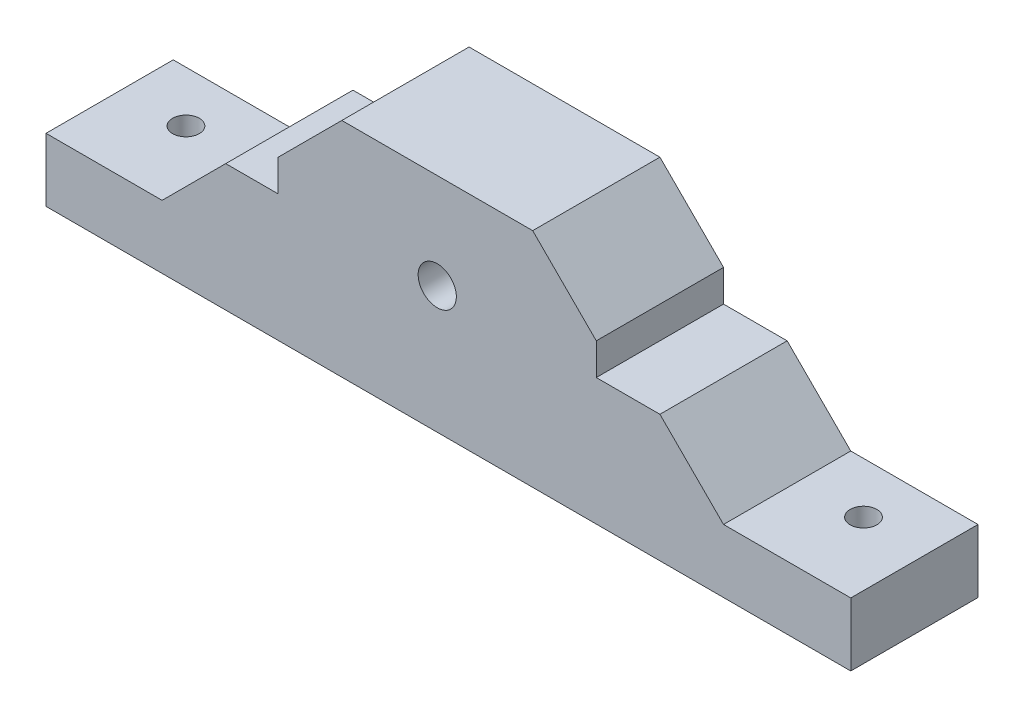
ISO-10303-21;
HEADER;
FILE_DESCRIPTION(('STEP AP214'),'2;1');
FILE_NAME('part.step','',(''),(''),'','','');
FILE_SCHEMA(('AUTOMOTIVE_DESIGN { 1 0 10303 214 1 1 1 1 }'));
ENDSEC;
DATA;
#1=APPLICATION_CONTEXT('core data for automotive mechanical design processes');
#2=APPLICATION_PROTOCOL_DEFINITION('international standard','automotive_design',2000,#1);
#3=PRODUCT_CONTEXT('',#1,'mechanical');
#4=PRODUCT('Part','Part','',(#3));
#5=PRODUCT_RELATED_PRODUCT_CATEGORY('part','',(#4));
#6=PRODUCT_DEFINITION_FORMATION('','',#4);
#7=PRODUCT_DEFINITION_CONTEXT('part definition',#1,'design');
#8=PRODUCT_DEFINITION('design','',#6,#7);
#9=PRODUCT_DEFINITION_SHAPE('','',#8);
#10=(LENGTH_UNIT() NAMED_UNIT(*) SI_UNIT(.MILLI.,.METRE.));
#11=(NAMED_UNIT(*) PLANE_ANGLE_UNIT() SI_UNIT($,.RADIAN.));
#12=(NAMED_UNIT(*) SI_UNIT($,.STERADIAN.) SOLID_ANGLE_UNIT());
#13=UNCERTAINTY_MEASURE_WITH_UNIT(LENGTH_MEASURE(1.E-05),#10,'distance_accuracy_value','');
#14=(GEOMETRIC_REPRESENTATION_CONTEXT(3) GLOBAL_UNCERTAINTY_ASSIGNED_CONTEXT((#13)) GLOBAL_UNIT_ASSIGNED_CONTEXT((#10,
#11,#12)) REPRESENTATION_CONTEXT('',''));
#15=CARTESIAN_POINT('',(0.,0.,0.));
#16=DIRECTION('',(0.,0.,1.));
#17=DIRECTION('',(1.,0.,0.));
#18=AXIS2_PLACEMENT_3D('',#15,#16,#17);
#19=CARTESIAN_POINT('',(-2.3424896013391E-12,254.195974268059,0.));
#20=DIRECTION('',(0.,1.,0.));
#21=DIRECTION('',(-1.,0.,0.));
#22=AXIS2_PLACEMENT_3D('',#19,#20,#21);
#23=PLANE('',#22);
#24=DIRECTION('',(-1.,0.,0.));
#25=VECTOR('',#24,1.);
#26=CARTESIAN_POINT('',(128.058980693892,254.19597426806,32.2731298363772));
#27=LINE('',#26,#25);
#28=CARTESIAN_POINT('',(128.058980693892,254.19597426806,32.2731298363772));
#29=VERTEX_POINT('',#28);
#30=CARTESIAN_POINT('',(1.55898069389335,254.195974268059,32.2731298363772));
#31=VERTEX_POINT('',#30);
#32=EDGE_CURVE('E203',#29,#31,#27,.T.);
#33=ORIENTED_EDGE('',*,*,#32,.F.);
#34=DIRECTION('',(0.,0.,-1.));
#35=VECTOR('',#34,1.);
#36=CARTESIAN_POINT('',(128.058980693892,254.19597426806,52.2731298363772));
#37=LINE('',#36,#35);
#38=CARTESIAN_POINT('',(128.058980693892,254.19597426806,52.2731298363772));
#39=VERTEX_POINT('',#38);
#40=EDGE_CURVE('E195',#39,#29,#37,.T.);
#41=ORIENTED_EDGE('',*,*,#40,.F.);
#42=DIRECTION('',(1.,0.,0.));
#43=VECTOR('',#42,1.);
#44=CARTESIAN_POINT('',(1.55898069389246,254.195974268059,52.2731298363772));
#45=LINE('',#44,#43);
#46=CARTESIAN_POINT('',(1.55898069389246,254.195974268059,52.2731298363772));
#47=VERTEX_POINT('',#46);
#48=EDGE_CURVE('E198',#47,#39,#45,.T.);
#49=ORIENTED_EDGE('',*,*,#48,.F.);
#50=DIRECTION('',(0.,0.,1.));
#51=VECTOR('',#50,1.);
#52=CARTESIAN_POINT('',(1.55898069389335,254.195974268059,32.2731298363772));
#53=LINE('',#52,#51);
#54=EDGE_CURVE('E200',#31,#47,#53,.T.);
#55=ORIENTED_EDGE('',*,*,#54,.F.);
#56=EDGE_LOOP('',(#33,#41,#49,#55));
#57=FACE_BOUND('',#56,.T.);
#58=CARTESIAN_POINT('',(11.5589806899974,254.195974268059,40.2731298363773));
#59=DIRECTION('',(0.,1.,0.));
#60=DIRECTION('',(-1.,0.,0.));
#61=AXIS2_PLACEMENT_3D('',#58,#59,#60);
#62=CIRCLE('',#61,2.1);
#63=CARTESIAN_POINT('',(9.45898068999743,254.195974268059,40.2731298363773));
#64=VERTEX_POINT('',#63);
#65=EDGE_CURVE('E206',#64,#64,#62,.T.);
#66=ORIENTED_EDGE('',*,*,#65,.T.);
#67=EDGE_LOOP('',(#66));
#68=FACE_BOUND('',#67,.T.);
#69=CARTESIAN_POINT('',(118.058980693893,254.19597426806,40.2731298363773));
#70=DIRECTION('',(0.,1.,0.));
#71=DIRECTION('',(-1.,0.,0.));
#72=AXIS2_PLACEMENT_3D('',#69,#70,#71);
#73=CIRCLE('',#72,2.1);
#74=CARTESIAN_POINT('',(115.958980693893,254.19597426806,40.2731298363773));
#75=VERTEX_POINT('',#74);
#76=EDGE_CURVE('E184',#75,#75,#73,.T.);
#77=ORIENTED_EDGE('',*,*,#76,.T.);
#78=EDGE_LOOP('',(#77));
#79=FACE_BOUND('',#78,.T.);
#80=ADVANCED_FACE('F33',(#57,#68,#79),#23,.F.);
#81=CARTESIAN_POINT('',(128.058980693892,294.19597426806,32.2731298363772));
#82=DIRECTION('',(0.,0.,1.));
#83=DIRECTION('',(0.,-1.,0.));
#84=AXIS2_PLACEMENT_3D('',#81,#82,#83);
#85=PLANE('',#84);
#86=CARTESIAN_POINT('',(63.0589806938941,274.145974268058,32.2731298363772));
#87=DIRECTION('',(0.,0.,-1.));
#88=DIRECTION('',(0.,1.,0.));
#89=AXIS2_PLACEMENT_3D('',#86,#87,#88);
#90=CIRCLE('',#89,3.);
#91=CARTESIAN_POINT('',(63.0589806938941,277.145974268058,32.2731298363772));
#92=VERTEX_POINT('',#91);
#93=EDGE_CURVE('E251',#92,#92,#90,.T.);
#94=ORIENTED_EDGE('',*,*,#93,.F.);
#95=EDGE_LOOP('',(#94));
#96=FACE_BOUND('',#95,.T.);
#97=DIRECTION('',(-1.,0.,0.));
#98=VECTOR('',#97,1.);
#99=CARTESIAN_POINT('',(1.55898069389326,264.14597426806,32.2731298363772));
#100=LINE('',#99,#98);
#101=CARTESIAN_POINT('',(19.8089806938926,264.14597426806,32.2731298363772));
#102=VERTEX_POINT('',#101);
#103=CARTESIAN_POINT('',(1.55898069389326,264.14597426806,32.2731298363772));
#104=VERTEX_POINT('',#103);
#105=EDGE_CURVE('E152',#102,#104,#100,.T.);
#106=ORIENTED_EDGE('',*,*,#105,.F.);
#107=DIRECTION('',(-0.707106781186557,-0.707106781186538,0.));
#108=VECTOR('',#107,1.);
#109=CARTESIAN_POINT('',(19.8089806938926,264.145974268058,32.2731298363772));
#110=LINE('',#109,#108);
#111=CARTESIAN_POINT('',(29.8089806938927,274.145974268058,32.2731298363772));
#112=VERTEX_POINT('',#111);
#113=EDGE_CURVE('E156',#102,#112,#110,.F.);
#114=ORIENTED_EDGE('',*,*,#113,.T.);
#115=DIRECTION('',(-1.,0.,0.));
#116=VECTOR('',#115,1.);
#117=CARTESIAN_POINT('',(19.8089806938926,274.145974268058,32.2731298363772));
#118=LINE('',#117,#116);
#119=CARTESIAN_POINT('',(38.0589806938921,274.145974268058,32.2731298363772));
#120=VERTEX_POINT('',#119);
#121=EDGE_CURVE('E224',#120,#112,#118,.T.);
#122=ORIENTED_EDGE('',*,*,#121,.F.);
#123=DIRECTION('',(0.,-1.,0.));
#124=VECTOR('',#123,1.);
#125=CARTESIAN_POINT('',(38.0589806938921,289.14597426806,32.2731298363772));
#126=LINE('',#125,#124);
#127=CARTESIAN_POINT('',(38.0589806938921,279.14597426806,32.2731298363772));
#128=VERTEX_POINT('',#127);
#129=EDGE_CURVE('E226',#128,#120,#126,.T.);
#130=ORIENTED_EDGE('',*,*,#129,.F.);
#131=DIRECTION('',(-0.707106781186549,-0.707106781186546,0.));
#132=VECTOR('',#131,1.);
#133=CARTESIAN_POINT('',(38.0589806938921,279.14597426806,32.2731298363772));
#134=LINE('',#133,#132);
#135=CARTESIAN_POINT('',(48.0589806938922,289.14597426806,32.2731298363772));
#136=VERTEX_POINT('',#135);
#137=EDGE_CURVE('E173',#128,#136,#134,.F.);
#138=ORIENTED_EDGE('',*,*,#137,.T.);
#139=DIRECTION('',(-1.,0.,0.));
#140=VECTOR('',#139,1.);
#141=CARTESIAN_POINT('',(88.0589806938921,289.14597426806,32.2731298363772));
#142=LINE('',#141,#140);
#143=CARTESIAN_POINT('',(78.0589806938921,289.14597426806,32.2731298363772));
#144=VERTEX_POINT('',#143);
#145=EDGE_CURVE('E228',#144,#136,#142,.T.);
#146=ORIENTED_EDGE('',*,*,#145,.F.);
#147=DIRECTION('',(-0.707106781186546,0.707106781186549,0.));
#148=VECTOR('',#147,1.);
#149=CARTESIAN_POINT('',(78.0589806938921,289.14597426806,32.2731298363772));
#150=LINE('',#149,#148);
#151=CARTESIAN_POINT('',(88.0589806938921,279.14597426806,32.2731298363772));
#152=VERTEX_POINT('',#151);
#153=EDGE_CURVE('E175',#144,#152,#150,.F.);
#154=ORIENTED_EDGE('',*,*,#153,.T.);
#155=DIRECTION('',(0.,1.,0.));
#156=VECTOR('',#155,1.);
#157=CARTESIAN_POINT('',(88.0589806938921,274.14597426806,32.2731298363772));
#158=LINE('',#157,#156);
#159=CARTESIAN_POINT('',(88.0589806938921,274.14597426806,32.2731298363772));
#160=VERTEX_POINT('',#159);
#161=EDGE_CURVE('E231',#160,#152,#158,.T.);
#162=ORIENTED_EDGE('',*,*,#161,.F.);
#163=DIRECTION('',(-1.,0.,0.));
#164=VECTOR('',#163,1.);
#165=CARTESIAN_POINT('',(108.058980693892,274.14597426806,32.2731298363772));
#166=LINE('',#165,#164);
#167=CARTESIAN_POINT('',(98.0589806938922,274.14597426806,32.2731298363772));
#168=VERTEX_POINT('',#167);
#169=EDGE_CURVE('E234',#168,#160,#166,.T.);
#170=ORIENTED_EDGE('',*,*,#169,.F.);
#171=DIRECTION('',(-0.707106781186547,0.707106781186548,0.));
#172=VECTOR('',#171,1.);
#173=CARTESIAN_POINT('',(98.0589806938921,274.14597426806,32.2731298363772));
#174=LINE('',#173,#172);
#175=CARTESIAN_POINT('',(108.058980693892,264.14597426806,32.2731298363772));
#176=VERTEX_POINT('',#175);
#177=EDGE_CURVE('E160',#168,#176,#174,.F.);
#178=ORIENTED_EDGE('',*,*,#177,.T.);
#179=DIRECTION('',(-1.,0.,0.));
#180=VECTOR('',#179,1.);
#181=CARTESIAN_POINT('',(108.058980693892,264.14597426806,32.2731298363772));
#182=LINE('',#181,#180);
#183=CARTESIAN_POINT('',(128.058980693892,264.14597426806,32.2731298363772));
#184=VERTEX_POINT('',#183);
#185=EDGE_CURVE('E142',#184,#176,#182,.T.);
#186=ORIENTED_EDGE('',*,*,#185,.F.);
#187=DIRECTION('',(0.,-1.,0.));
#188=VECTOR('',#187,1.);
#189=CARTESIAN_POINT('',(128.058980693892,294.19597426806,32.2731298363772));
#190=LINE('',#189,#188);
#191=EDGE_CURVE('E193',#184,#29,#190,.T.);
#192=ORIENTED_EDGE('',*,*,#191,.T.);
#193=ORIENTED_EDGE('',*,*,#32,.T.);
#194=DIRECTION('',(0.,-1.,0.));
#195=VECTOR('',#194,1.);
#196=CARTESIAN_POINT('',(1.55898069389298,294.195974268059,32.2731298363772));
#197=LINE('',#196,#195);
#198=EDGE_CURVE('E180',#104,#31,#197,.T.);
#199=ORIENTED_EDGE('',*,*,#198,.F.);
#200=EDGE_LOOP('',(#106,#114,#122,#130,#138,#146,#154,#162,#170,#178,#186,#192,#193,#199));
#201=FACE_BOUND('',#200,.T.);
#202=ADVANCED_FACE('F265',(#96,#201),#85,.F.);
#203=CARTESIAN_POINT('',(1.55898069389298,294.195974268059,32.2731298363772));
#204=DIRECTION('',(1.,0.,0.));
#205=DIRECTION('',(0.,0.,-1.));
#206=AXIS2_PLACEMENT_3D('',#203,#204,#205);
#207=PLANE('',#206);
#208=DIRECTION('',(0.,-1.,0.));
#209=VECTOR('',#208,1.);
#210=CARTESIAN_POINT('',(1.55898069389208,294.195974268059,52.2731298363772));
#211=LINE('',#210,#209);
#212=CARTESIAN_POINT('',(1.55898069389326,264.14597426806,52.2731298363772));
#213=VERTEX_POINT('',#212);
#214=EDGE_CURVE('E190',#213,#47,#211,.T.);
#215=ORIENTED_EDGE('',*,*,#214,.F.);
#216=DIRECTION('',(0.,0.,-1.));
#217=VECTOR('',#216,1.);
#218=CARTESIAN_POINT('',(1.55898069389326,264.14597426806,52.2731298363772));
#219=LINE('',#218,#217);
#220=EDGE_CURVE('E188',#213,#104,#219,.T.);
#221=ORIENTED_EDGE('',*,*,#220,.T.);
#222=ORIENTED_EDGE('',*,*,#198,.T.);
#223=ORIENTED_EDGE('',*,*,#54,.T.);
#224=EDGE_LOOP('',(#215,#221,#222,#223));
#225=FACE_BOUND('',#224,.T.);
#226=ADVANCED_FACE('F268',(#225),#207,.F.);
#227=CARTESIAN_POINT('',(1.55898069389208,294.195974268059,52.2731298363772));
#228=DIRECTION('',(0.,0.,-1.));
#229=DIRECTION('',(0.,1.,0.));
#230=AXIS2_PLACEMENT_3D('',#227,#228,#229);
#231=PLANE('',#230);
#232=CARTESIAN_POINT('',(63.0589806938941,274.145974268058,52.2731298363772));
#233=DIRECTION('',(0.,0.,-1.));
#234=DIRECTION('',(0.,1.,0.));
#235=AXIS2_PLACEMENT_3D('',#232,#233,#234);
#236=CIRCLE('',#235,3.);
#237=CARTESIAN_POINT('',(63.0589806938941,277.145974268058,52.2731298363772));
#238=VERTEX_POINT('',#237);
#239=EDGE_CURVE('E237',#238,#238,#236,.T.);
#240=ORIENTED_EDGE('',*,*,#239,.T.);
#241=EDGE_LOOP('',(#240));
#242=FACE_BOUND('',#241,.T.);
#243=DIRECTION('',(-1.,0.,0.));
#244=VECTOR('',#243,1.);
#245=CARTESIAN_POINT('',(19.8089806938926,274.145974268058,52.2731298363772));
#246=LINE('',#245,#244);
#247=CARTESIAN_POINT('',(38.0589806938921,274.145974268058,52.2731298363772));
#248=VERTEX_POINT('',#247);
#249=CARTESIAN_POINT('',(29.8089806938927,274.145974268058,52.2731298363772));
#250=VERTEX_POINT('',#249);
#251=EDGE_CURVE('E240',#248,#250,#246,.T.);
#252=ORIENTED_EDGE('',*,*,#251,.T.);
#253=DIRECTION('',(0.707106781186557,0.707106781186538,0.));
#254=VECTOR('',#253,1.);
#255=CARTESIAN_POINT('',(19.8089806938926,264.145974268058,52.2731298363772));
#256=LINE('',#255,#254);
#257=CARTESIAN_POINT('',(19.8089806938926,264.14597426806,52.2731298363772));
#258=VERTEX_POINT('',#257);
#259=EDGE_CURVE('E41',#250,#258,#256,.F.);
#260=ORIENTED_EDGE('',*,*,#259,.T.);
#261=DIRECTION('',(-1.,0.,0.));
#262=VECTOR('',#261,1.);
#263=CARTESIAN_POINT('',(1.55898069389326,264.14597426806,52.2731298363772));
#264=LINE('',#263,#262);
#265=EDGE_CURVE('E211',#258,#213,#264,.T.);
#266=ORIENTED_EDGE('',*,*,#265,.T.);
#267=ORIENTED_EDGE('',*,*,#214,.T.);
#268=ORIENTED_EDGE('',*,*,#48,.T.);
#269=DIRECTION('',(0.,-1.,0.));
#270=VECTOR('',#269,1.);
#271=CARTESIAN_POINT('',(128.058980693892,294.19597426806,52.2731298363772));
#272=LINE('',#271,#270);
#273=CARTESIAN_POINT('',(128.058980693892,264.14597426806,52.2731298363772));
#274=VERTEX_POINT('',#273);
#275=EDGE_CURVE('E150',#274,#39,#272,.T.);
#276=ORIENTED_EDGE('',*,*,#275,.F.);
#277=DIRECTION('',(-1.,0.,0.));
#278=VECTOR('',#277,1.);
#279=CARTESIAN_POINT('',(108.058980693892,264.14597426806,52.2731298363772));
#280=LINE('',#279,#278);
#281=CARTESIAN_POINT('',(108.058980693892,264.14597426806,52.2731298363772));
#282=VERTEX_POINT('',#281);
#283=EDGE_CURVE('E139',#274,#282,#280,.T.);
#284=ORIENTED_EDGE('',*,*,#283,.T.);
#285=DIRECTION('',(0.707106781186547,-0.707106781186548,0.));
#286=VECTOR('',#285,1.);
#287=CARTESIAN_POINT('',(98.0589806938921,274.14597426806,52.2731298363772));
#288=LINE('',#287,#286);
#289=CARTESIAN_POINT('',(98.0589806938922,274.14597426806,52.2731298363772));
#290=VERTEX_POINT('',#289);
#291=EDGE_CURVE('E48',#282,#290,#288,.F.);
#292=ORIENTED_EDGE('',*,*,#291,.T.);
#293=DIRECTION('',(-1.,0.,0.));
#294=VECTOR('',#293,1.);
#295=CARTESIAN_POINT('',(108.058980693892,274.14597426806,52.2731298363772));
#296=LINE('',#295,#294);
#297=CARTESIAN_POINT('',(88.0589806938921,274.14597426806,52.2731298363772));
#298=VERTEX_POINT('',#297);
#299=EDGE_CURVE('E151',#290,#298,#296,.T.);
#300=ORIENTED_EDGE('',*,*,#299,.T.);
#301=DIRECTION('',(0.,1.,0.));
#302=VECTOR('',#301,1.);
#303=CARTESIAN_POINT('',(88.0589806938921,274.14597426806,52.2731298363772));
#304=LINE('',#303,#302);
#305=CARTESIAN_POINT('',(88.0589806938921,279.14597426806,52.2731298363772));
#306=VERTEX_POINT('',#305);
#307=EDGE_CURVE('E247',#298,#306,#304,.T.);
#308=ORIENTED_EDGE('',*,*,#307,.T.);
#309=DIRECTION('',(0.707106781186546,-0.707106781186549,0.));
#310=VECTOR('',#309,1.);
#311=CARTESIAN_POINT('',(78.0589806938921,289.14597426806,52.2731298363772));
#312=LINE('',#311,#310);
#313=CARTESIAN_POINT('',(78.0589806938921,289.14597426806,52.2731298363772));
#314=VERTEX_POINT('',#313);
#315=EDGE_CURVE('E166',#306,#314,#312,.F.);
#316=ORIENTED_EDGE('',*,*,#315,.T.);
#317=DIRECTION('',(-1.,0.,0.));
#318=VECTOR('',#317,1.);
#319=CARTESIAN_POINT('',(88.0589806938921,289.14597426806,52.2731298363772));
#320=LINE('',#319,#318);
#321=CARTESIAN_POINT('',(48.0589806938922,289.14597426806,52.2731298363772));
#322=VERTEX_POINT('',#321);
#323=EDGE_CURVE('E244',#314,#322,#320,.T.);
#324=ORIENTED_EDGE('',*,*,#323,.T.);
#325=DIRECTION('',(0.707106781186549,0.707106781186546,0.));
#326=VECTOR('',#325,1.);
#327=CARTESIAN_POINT('',(38.0589806938921,279.14597426806,52.2731298363772));
#328=LINE('',#327,#326);
#329=CARTESIAN_POINT('',(38.0589806938921,279.14597426806,52.2731298363772));
#330=VERTEX_POINT('',#329);
#331=EDGE_CURVE('E164',#322,#330,#328,.F.);
#332=ORIENTED_EDGE('',*,*,#331,.T.);
#333=DIRECTION('',(0.,-1.,0.));
#334=VECTOR('',#333,1.);
#335=CARTESIAN_POINT('',(38.0589806938921,289.14597426806,52.2731298363772));
#336=LINE('',#335,#334);
#337=EDGE_CURVE('E242',#330,#248,#336,.T.);
#338=ORIENTED_EDGE('',*,*,#337,.T.);
#339=EDGE_LOOP('',(#252,#260,#266,#267,#268,#276,#284,#292,#300,#308,#316,#324,#332,#338));
#340=FACE_BOUND('',#339,.T.);
#341=ADVANCED_FACE('F148',(#242,#340),#231,.F.);
#342=CARTESIAN_POINT('',(128.058980693892,294.19597426806,52.2731298363772));
#343=DIRECTION('',(-1.,0.,0.));
#344=DIRECTION('',(0.,-1.,0.));
#345=AXIS2_PLACEMENT_3D('',#342,#343,#344);
#346=PLANE('',#345);
#347=ORIENTED_EDGE('',*,*,#191,.F.);
#348=DIRECTION('',(0.,0.,-1.));
#349=VECTOR('',#348,1.);
#350=CARTESIAN_POINT('',(128.058980693892,264.14597426806,52.2731298363772));
#351=LINE('',#350,#349);
#352=EDGE_CURVE('E145',#274,#184,#351,.T.);
#353=ORIENTED_EDGE('',*,*,#352,.F.);
#354=ORIENTED_EDGE('',*,*,#275,.T.);
#355=ORIENTED_EDGE('',*,*,#40,.T.);
#356=EDGE_LOOP('',(#347,#353,#354,#355));
#357=FACE_BOUND('',#356,.T.);
#358=ADVANCED_FACE('F304',(#357),#346,.F.);
#359=CARTESIAN_POINT('',(11.5589806899971,294.195974268059,40.2731298363773));
#360=DIRECTION('',(0.,-1.,0.));
#361=DIRECTION('',(1.,0.,0.));
#362=AXIS2_PLACEMENT_3D('',#359,#360,#361);
#363=CYLINDRICAL_SURFACE('',#362,2.1);
#364=CARTESIAN_POINT('',(11.5589806899973,264.14597426806,40.2731298363773));
#365=DIRECTION('',(0.,-1.,0.));
#366=DIRECTION('',(0.,0.,-1.));
#367=AXIS2_PLACEMENT_3D('',#364,#365,#366);
#368=CIRCLE('',#367,2.1);
#369=CARTESIAN_POINT('',(11.5589806899973,264.14597426806,38.1731298363772));
#370=VERTEX_POINT('',#369);
#371=EDGE_CURVE('E181',#370,#370,#368,.T.);
#372=ORIENTED_EDGE('',*,*,#371,.F.);
#373=EDGE_LOOP('',(#372));
#374=FACE_BOUND('',#373,.T.);
#375=ORIENTED_EDGE('',*,*,#65,.F.);
#376=EDGE_LOOP('',(#375));
#377=FACE_BOUND('',#376,.T.);
#378=ADVANCED_FACE('F302',(#374,#377),#363,.F.);
#379=CARTESIAN_POINT('',(118.058980693892,294.19597426806,40.2731298363773));
#380=DIRECTION('',(0.,-1.,0.));
#381=DIRECTION('',(1.,0.,0.));
#382=AXIS2_PLACEMENT_3D('',#379,#380,#381);
#383=CYLINDRICAL_SURFACE('',#382,2.1);
#384=CARTESIAN_POINT('',(118.058980693892,264.14597426806,40.2731298363773));
#385=DIRECTION('',(0.,-1.,0.));
#386=DIRECTION('',(0.,0.,-1.));
#387=AXIS2_PLACEMENT_3D('',#384,#385,#386);
#388=CIRCLE('',#387,2.1);
#389=CARTESIAN_POINT('',(118.058980693892,264.14597426806,38.1731298363772));
#390=VERTEX_POINT('',#389);
#391=EDGE_CURVE('E185',#390,#390,#388,.T.);
#392=ORIENTED_EDGE('',*,*,#391,.F.);
#393=EDGE_LOOP('',(#392));
#394=FACE_BOUND('',#393,.T.);
#395=ORIENTED_EDGE('',*,*,#76,.F.);
#396=EDGE_LOOP('',(#395));
#397=FACE_BOUND('',#396,.T.);
#398=ADVANCED_FACE('F334',(#394,#397),#383,.F.);
#399=CARTESIAN_POINT('',(1.55898069389326,264.14597426806,52.2731298363772));
#400=DIRECTION('',(0.,-1.,0.));
#401=DIRECTION('',(0.,0.,-1.));
#402=AXIS2_PLACEMENT_3D('',#399,#400,#401);
#403=PLANE('',#402);
#404=ORIENTED_EDGE('',*,*,#371,.T.);
#405=EDGE_LOOP('',(#404));
#406=FACE_BOUND('',#405,.T.);
#407=ORIENTED_EDGE('',*,*,#105,.T.);
#408=ORIENTED_EDGE('',*,*,#220,.F.);
#409=ORIENTED_EDGE('',*,*,#265,.F.);
#410=DIRECTION('',(0.,0.,-1.));
#411=VECTOR('',#410,1.);
#412=CARTESIAN_POINT('',(19.8089806938926,264.14597426806,52.2731298363772));
#413=LINE('',#412,#411);
#414=EDGE_CURVE('E218',#258,#102,#413,.T.);
#415=ORIENTED_EDGE('',*,*,#414,.T.);
#416=EDGE_LOOP('',(#407,#408,#409,#415));
#417=FACE_BOUND('',#416,.T.);
#418=ADVANCED_FACE('F274',(#406,#417),#403,.F.);
#419=CARTESIAN_POINT('',(19.8089806938926,274.145974268058,52.2731298363772));
#420=DIRECTION('',(0.,-1.,0.));
#421=DIRECTION('',(1.,0.,0.));
#422=AXIS2_PLACEMENT_3D('',#419,#420,#421);
#423=PLANE('',#422);
#424=ORIENTED_EDGE('',*,*,#121,.T.);
#425=DIRECTION('',(0.,0.,1.));
#426=VECTOR('',#425,1.);
#427=CARTESIAN_POINT('',(29.8089806938927,274.145974268058,52.2731298363772));
#428=LINE('',#427,#426);
#429=EDGE_CURVE('E56',#112,#250,#428,.T.);
#430=ORIENTED_EDGE('',*,*,#429,.T.);
#431=ORIENTED_EDGE('',*,*,#251,.F.);
#432=DIRECTION('',(0.,0.,-1.));
#433=VECTOR('',#432,1.);
#434=CARTESIAN_POINT('',(38.0589806938921,274.145974268058,52.2731298363772));
#435=LINE('',#434,#433);
#436=EDGE_CURVE('E215',#248,#120,#435,.T.);
#437=ORIENTED_EDGE('',*,*,#436,.T.);
#438=EDGE_LOOP('',(#424,#430,#431,#437));
#439=FACE_BOUND('',#438,.T.);
#440=ADVANCED_FACE('F325',(#439),#423,.F.);
#441=CARTESIAN_POINT('',(38.0589806938921,289.14597426806,52.2731298363772));
#442=DIRECTION('',(1.,0.,0.));
#443=DIRECTION('',(0.,0.,-1.));
#444=AXIS2_PLACEMENT_3D('',#441,#442,#443);
#445=PLANE('',#444);
#446=ORIENTED_EDGE('',*,*,#337,.F.);
#447=DIRECTION('',(0.,0.,-1.));
#448=VECTOR('',#447,1.);
#449=CARTESIAN_POINT('',(38.0589806938921,279.14597426806,52.2731298363772));
#450=LINE('',#449,#448);
#451=EDGE_CURVE('E177',#330,#128,#450,.T.);
#452=ORIENTED_EDGE('',*,*,#451,.T.);
#453=ORIENTED_EDGE('',*,*,#129,.T.);
#454=ORIENTED_EDGE('',*,*,#436,.F.);
#455=EDGE_LOOP('',(#446,#452,#453,#454));
#456=FACE_BOUND('',#455,.T.);
#457=ADVANCED_FACE('F323',(#456),#445,.F.);
#458=CARTESIAN_POINT('',(88.0589806938921,289.14597426806,52.2731298363772));
#459=DIRECTION('',(0.,-1.,0.));
#460=DIRECTION('',(0.,0.,-1.));
#461=AXIS2_PLACEMENT_3D('',#458,#459,#460);
#462=PLANE('',#461);
#463=ORIENTED_EDGE('',*,*,#145,.T.);
#464=DIRECTION('',(0.,0.,1.));
#465=VECTOR('',#464,1.);
#466=CARTESIAN_POINT('',(48.0589806938922,289.14597426806,52.2731298363772));
#467=LINE('',#466,#465);
#468=EDGE_CURVE('E168',#136,#322,#467,.T.);
#469=ORIENTED_EDGE('',*,*,#468,.T.);
#470=ORIENTED_EDGE('',*,*,#323,.F.);
#471=DIRECTION('',(0.,0.,-1.));
#472=VECTOR('',#471,1.);
#473=CARTESIAN_POINT('',(78.0589806938921,289.14597426806,52.2731298363772));
#474=LINE('',#473,#472);
#475=EDGE_CURVE('E170',#314,#144,#474,.T.);
#476=ORIENTED_EDGE('',*,*,#475,.T.);
#477=EDGE_LOOP('',(#463,#469,#470,#476));
#478=FACE_BOUND('',#477,.T.);
#479=ADVANCED_FACE('F332',(#478),#462,.F.);
#480=CARTESIAN_POINT('',(88.0589806938921,274.14597426806,52.2731298363772));
#481=DIRECTION('',(-1.,0.,0.));
#482=DIRECTION('',(0.,0.,1.));
#483=AXIS2_PLACEMENT_3D('',#480,#481,#482);
#484=PLANE('',#483);
#485=ORIENTED_EDGE('',*,*,#161,.T.);
#486=DIRECTION('',(0.,0.,1.));
#487=VECTOR('',#486,1.);
#488=CARTESIAN_POINT('',(88.0589806938921,279.14597426806,52.2731298363772));
#489=LINE('',#488,#487);
#490=EDGE_CURVE('E162',#152,#306,#489,.T.);
#491=ORIENTED_EDGE('',*,*,#490,.T.);
#492=ORIENTED_EDGE('',*,*,#307,.F.);
#493=DIRECTION('',(0.,0.,-1.));
#494=VECTOR('',#493,1.);
#495=CARTESIAN_POINT('',(88.0589806938921,274.14597426806,52.2731298363772));
#496=LINE('',#495,#494);
#497=EDGE_CURVE('E144',#298,#160,#496,.T.);
#498=ORIENTED_EDGE('',*,*,#497,.T.);
#499=EDGE_LOOP('',(#485,#491,#492,#498));
#500=FACE_BOUND('',#499,.T.);
#501=ADVANCED_FACE('F340',(#500),#484,.F.);
#502=CARTESIAN_POINT('',(108.058980693892,274.14597426806,52.2731298363772));
#503=DIRECTION('',(0.,-1.,0.));
#504=DIRECTION('',(1.,0.,0.));
#505=AXIS2_PLACEMENT_3D('',#502,#503,#504);
#506=PLANE('',#505);
#507=ORIENTED_EDGE('',*,*,#299,.F.);
#508=DIRECTION('',(0.,0.,-1.));
#509=VECTOR('',#508,1.);
#510=CARTESIAN_POINT('',(98.0589806938922,274.14597426806,52.2731298363772));
#511=LINE('',#510,#509);
#512=EDGE_CURVE('E11',#290,#168,#511,.T.);
#513=ORIENTED_EDGE('',*,*,#512,.T.);
#514=ORIENTED_EDGE('',*,*,#169,.T.);
#515=ORIENTED_EDGE('',*,*,#497,.F.);
#516=EDGE_LOOP('',(#507,#513,#514,#515));
#517=FACE_BOUND('',#516,.T.);
#518=ADVANCED_FACE('F344',(#517),#506,.F.);
#519=CARTESIAN_POINT('',(108.058980693892,264.14597426806,52.2731298363772));
#520=DIRECTION('',(0.,-1.,0.));
#521=DIRECTION('',(0.,0.,-1.));
#522=AXIS2_PLACEMENT_3D('',#519,#520,#521);
#523=PLANE('',#522);
#524=ORIENTED_EDGE('',*,*,#391,.T.);
#525=EDGE_LOOP('',(#524));
#526=FACE_BOUND('',#525,.T.);
#527=ORIENTED_EDGE('',*,*,#185,.T.);
#528=DIRECTION('',(0.,0.,-1.));
#529=VECTOR('',#528,1.);
#530=CARTESIAN_POINT('',(108.058980693892,264.14597426806,52.2731298363772));
#531=LINE('',#530,#529);
#532=EDGE_CURVE('E137',#282,#176,#531,.T.);
#533=ORIENTED_EDGE('',*,*,#532,.F.);
#534=ORIENTED_EDGE('',*,*,#283,.F.);
#535=ORIENTED_EDGE('',*,*,#352,.T.);
#536=EDGE_LOOP('',(#527,#533,#534,#535));
#537=FACE_BOUND('',#536,.T.);
#538=ADVANCED_FACE('F138',(#526,#537),#523,.F.);
#539=CARTESIAN_POINT('',(63.0589806938941,274.145974268058,52.2731298363772));
#540=DIRECTION('',(0.,0.,-1.));
#541=DIRECTION('',(0.,1.,0.));
#542=AXIS2_PLACEMENT_3D('',#539,#540,#541);
#543=CYLINDRICAL_SURFACE('',#542,3.);
#544=ORIENTED_EDGE('',*,*,#239,.F.);
#545=EDGE_LOOP('',(#544));
#546=FACE_BOUND('',#545,.T.);
#547=ORIENTED_EDGE('',*,*,#93,.T.);
#548=EDGE_LOOP('',(#547));
#549=FACE_BOUND('',#548,.T.);
#550=ADVANCED_FACE('F258',(#546,#549),#543,.F.);
#551=CARTESIAN_POINT('',(38.0589806938921,279.14597426806,52.2731298363772));
#552=DIRECTION('',(0.707106781186545,-0.707106781186549,0.));
#553=DIRECTION('',(0.,0.,-1.));
#554=AXIS2_PLACEMENT_3D('',#551,#552,#553);
#555=PLANE('',#554);
#556=ORIENTED_EDGE('',*,*,#331,.F.);
#557=ORIENTED_EDGE('',*,*,#468,.F.);
#558=ORIENTED_EDGE('',*,*,#137,.F.);
#559=ORIENTED_EDGE('',*,*,#451,.F.);
#560=EDGE_LOOP('',(#556,#557,#558,#559));
#561=FACE_BOUND('',#560,.T.);
#562=ADVANCED_FACE('F261',(#561),#555,.F.);
#563=CARTESIAN_POINT('',(78.0589806938921,289.14597426806,52.2731298363772));
#564=DIRECTION('',(-0.707106781186549,-0.707106781186546,0.));
#565=DIRECTION('',(0.,0.,-1.));
#566=AXIS2_PLACEMENT_3D('',#563,#564,#565);
#567=PLANE('',#566);
#568=ORIENTED_EDGE('',*,*,#315,.F.);
#569=ORIENTED_EDGE('',*,*,#490,.F.);
#570=ORIENTED_EDGE('',*,*,#153,.F.);
#571=ORIENTED_EDGE('',*,*,#475,.F.);
#572=EDGE_LOOP('',(#568,#569,#570,#571));
#573=FACE_BOUND('',#572,.T.);
#574=ADVANCED_FACE('F286',(#573),#567,.F.);
#575=CARTESIAN_POINT('',(19.8089806938926,264.145974268058,52.2731298363772));
#576=DIRECTION('',(0.707106781186538,-0.707106781186557,0.));
#577=DIRECTION('',(0.,0.,-1.));
#578=AXIS2_PLACEMENT_3D('',#575,#576,#577);
#579=PLANE('',#578);
#580=ORIENTED_EDGE('',*,*,#259,.F.);
#581=ORIENTED_EDGE('',*,*,#429,.F.);
#582=ORIENTED_EDGE('',*,*,#113,.F.);
#583=ORIENTED_EDGE('',*,*,#414,.F.);
#584=EDGE_LOOP('',(#580,#581,#582,#583));
#585=FACE_BOUND('',#584,.T.);
#586=ADVANCED_FACE('F284',(#585),#579,.F.);
#587=CARTESIAN_POINT('',(98.0589806938921,274.14597426806,52.2731298363772));
#588=DIRECTION('',(-0.707106781186548,-0.707106781186547,0.));
#589=DIRECTION('',(0.,0.,-1.));
#590=AXIS2_PLACEMENT_3D('',#587,#588,#589);
#591=PLANE('',#590);
#592=ORIENTED_EDGE('',*,*,#291,.F.);
#593=ORIENTED_EDGE('',*,*,#532,.T.);
#594=ORIENTED_EDGE('',*,*,#177,.F.);
#595=ORIENTED_EDGE('',*,*,#512,.F.);
#596=EDGE_LOOP('',(#592,#593,#594,#595));
#597=FACE_BOUND('',#596,.T.);
#598=ADVANCED_FACE('F35',(#597),#591,.F.);
#599=CLOSED_SHELL('',(#80,#202,#226,#341,#358,#378,#398,#418,#440,#457,#479,#501,#518,#538,#550,
#562,#574,#586,#598));
#600=MANIFOLD_SOLID_BREP('B2',#599);
#601=ADVANCED_BREP_SHAPE_REPRESENTATION('',(#18,#600),#14);
#602=SHAPE_DEFINITION_REPRESENTATION(#9,#601);
ENDSEC;
END-ISO-10303-21;
